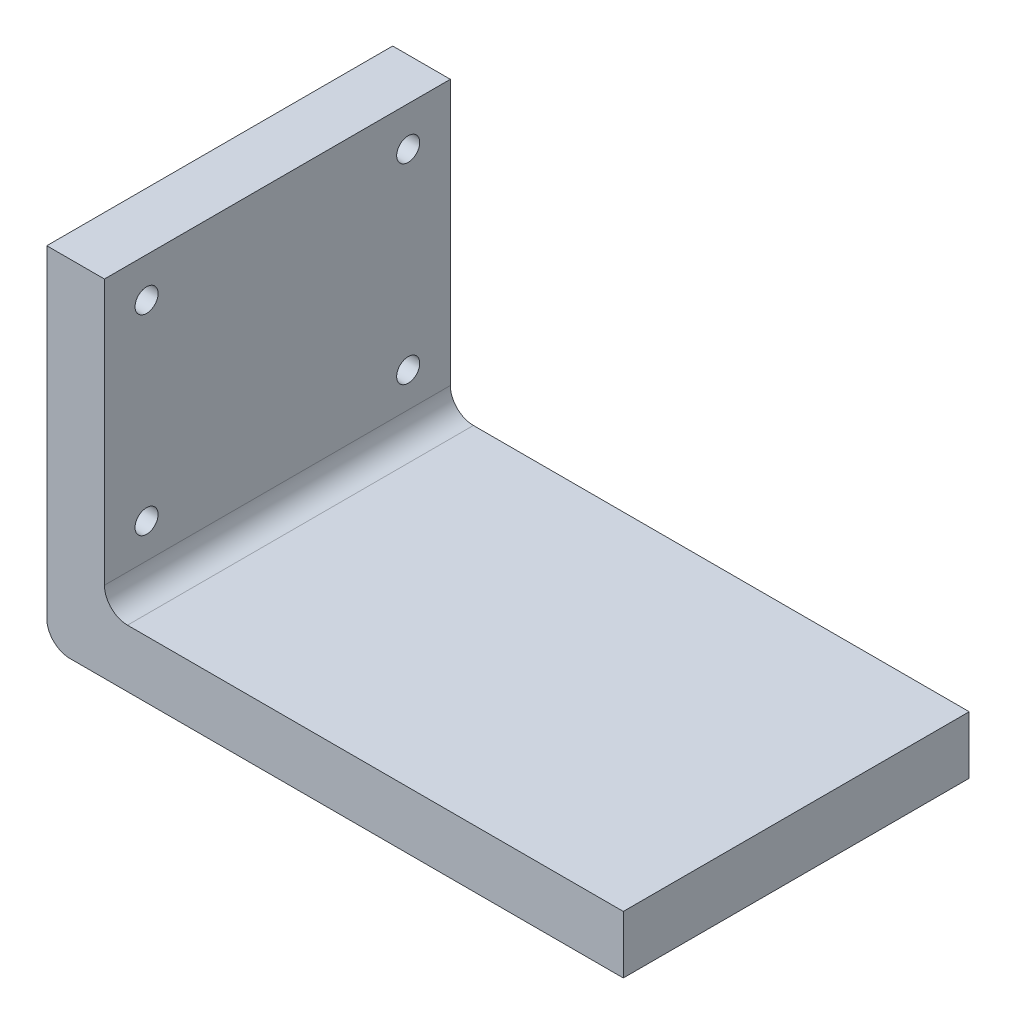
ISO-10303-21;
HEADER;
FILE_DESCRIPTION(('STEP AP214'),'2;1');
FILE_NAME('part.step','',(''),(''),'','','');
FILE_SCHEMA(('AUTOMOTIVE_DESIGN { 1 0 10303 214 1 1 1 1 }'));
ENDSEC;
DATA;
#1=APPLICATION_CONTEXT('core data for automotive mechanical design processes');
#2=APPLICATION_PROTOCOL_DEFINITION('international standard','automotive_design',2000,#1);
#3=PRODUCT_CONTEXT('',#1,'mechanical');
#4=PRODUCT('Part','Part','',(#3));
#5=PRODUCT_RELATED_PRODUCT_CATEGORY('part','',(#4));
#6=PRODUCT_DEFINITION_FORMATION('','',#4);
#7=PRODUCT_DEFINITION_CONTEXT('part definition',#1,'design');
#8=PRODUCT_DEFINITION('design','',#6,#7);
#9=PRODUCT_DEFINITION_SHAPE('','',#8);
#10=(LENGTH_UNIT() NAMED_UNIT(*) SI_UNIT(.MILLI.,.METRE.));
#11=(NAMED_UNIT(*) PLANE_ANGLE_UNIT() SI_UNIT($,.RADIAN.));
#12=(NAMED_UNIT(*) SI_UNIT($,.STERADIAN.) SOLID_ANGLE_UNIT());
#13=UNCERTAINTY_MEASURE_WITH_UNIT(LENGTH_MEASURE(1.E-05),#10,'distance_accuracy_value','');
#14=(GEOMETRIC_REPRESENTATION_CONTEXT(3) GLOBAL_UNCERTAINTY_ASSIGNED_CONTEXT((#13)) GLOBAL_UNIT_ASSIGNED_CONTEXT((#10,
#11,#12)) REPRESENTATION_CONTEXT('',''));
#15=CARTESIAN_POINT('',(0.,0.,0.));
#16=DIRECTION('',(0.,0.,1.));
#17=DIRECTION('',(1.,0.,0.));
#18=AXIS2_PLACEMENT_3D('',#15,#16,#17);
#19=CARTESIAN_POINT('',(0.,76.2,76.2));
#20=DIRECTION('',(0.,-1.,0.));
#21=DIRECTION('',(0.,0.,-1.));
#22=AXIS2_PLACEMENT_3D('',#19,#20,#21);
#23=PLANE('',#22);
#24=DIRECTION('',(-1.,0.,0.));
#25=VECTOR('',#24,1.);
#26=CARTESIAN_POINT('',(0.,76.2,0.));
#27=LINE('',#26,#25);
#28=CARTESIAN_POINT('',(12.7,76.2,0.));
#29=VERTEX_POINT('',#28);
#30=CARTESIAN_POINT('',(0.,76.2,0.));
#31=VERTEX_POINT('',#30);
#32=EDGE_CURVE('E131',#29,#31,#27,.T.);
#33=ORIENTED_EDGE('',*,*,#32,.T.);
#34=DIRECTION('',(0.,0.,-1.));
#35=VECTOR('',#34,1.);
#36=CARTESIAN_POINT('',(0.,76.2,76.2));
#37=LINE('',#36,#35);
#38=CARTESIAN_POINT('',(0.,76.2,76.2));
#39=VERTEX_POINT('',#38);
#40=EDGE_CURVE('E11',#39,#31,#37,.T.);
#41=ORIENTED_EDGE('',*,*,#40,.F.);
#42=DIRECTION('',(-1.,0.,0.));
#43=VECTOR('',#42,1.);
#44=CARTESIAN_POINT('',(0.,76.2,76.2));
#45=LINE('',#44,#43);
#46=CARTESIAN_POINT('',(12.7,76.2,76.2));
#47=VERTEX_POINT('',#46);
#48=EDGE_CURVE('E145',#47,#39,#45,.T.);
#49=ORIENTED_EDGE('',*,*,#48,.F.);
#50=DIRECTION('',(0.,0.,-1.));
#51=VECTOR('',#50,1.);
#52=CARTESIAN_POINT('',(12.7,76.2,76.2));
#53=LINE('',#52,#51);
#54=EDGE_CURVE('E127',#47,#29,#53,.T.);
#55=ORIENTED_EDGE('',*,*,#54,.T.);
#56=EDGE_LOOP('',(#33,#41,#49,#55));
#57=FACE_BOUND('',#56,.T.);
#58=ADVANCED_FACE('F33',(#57),#23,.F.);
#59=CARTESIAN_POINT('',(0.,5.08000000000003,76.2));
#60=DIRECTION('',(1.,0.,0.));
#61=DIRECTION('',(0.,0.,-1.));
#62=AXIS2_PLACEMENT_3D('',#59,#60,#61);
#63=PLANE('',#62);
#64=CARTESIAN_POINT('',(0.,25.4,9.28440190668444));
#65=DIRECTION('',(-1.,0.,0.));
#66=DIRECTION('',(0.,0.,1.));
#67=AXIS2_PLACEMENT_3D('',#64,#65,#66);
#68=CIRCLE('',#67,2.54);
#69=CARTESIAN_POINT('',(0.,25.4,11.8244019066844));
#70=VERTEX_POINT('',#69);
#71=EDGE_CURVE('E214',#70,#70,#68,.T.);
#72=ORIENTED_EDGE('',*,*,#71,.F.);
#73=EDGE_LOOP('',(#72));
#74=FACE_BOUND('',#73,.T.);
#75=CARTESIAN_POINT('',(0.,67.5345582204279,66.9155980933156));
#76=DIRECTION('',(-1.,0.,0.));
#77=DIRECTION('',(0.,0.,1.));
#78=AXIS2_PLACEMENT_3D('',#75,#76,#77);
#79=CIRCLE('',#78,2.53999999999999);
#80=CARTESIAN_POINT('',(0.,67.5345582204279,69.4555980933156));
#81=VERTEX_POINT('',#80);
#82=EDGE_CURVE('E216',#81,#81,#79,.T.);
#83=ORIENTED_EDGE('',*,*,#82,.F.);
#84=EDGE_LOOP('',(#83));
#85=FACE_BOUND('',#84,.T.);
#86=CARTESIAN_POINT('',(0.,25.4,66.9155980933156));
#87=DIRECTION('',(-1.,0.,0.));
#88=DIRECTION('',(0.,0.,1.));
#89=AXIS2_PLACEMENT_3D('',#86,#87,#88);
#90=CIRCLE('',#89,2.54);
#91=CARTESIAN_POINT('',(0.,25.4,69.4555980933156));
#92=VERTEX_POINT('',#91);
#93=EDGE_CURVE('E213',#92,#92,#90,.T.);
#94=ORIENTED_EDGE('',*,*,#93,.F.);
#95=EDGE_LOOP('',(#94));
#96=FACE_BOUND('',#95,.T.);
#97=CARTESIAN_POINT('',(0.,67.5345582204279,9.28440190668444));
#98=DIRECTION('',(-1.,0.,0.));
#99=DIRECTION('',(0.,0.,1.));
#100=AXIS2_PLACEMENT_3D('',#97,#98,#99);
#101=CIRCLE('',#100,2.54);
#102=CARTESIAN_POINT('',(0.,67.5345582204279,11.8244019066844));
#103=VERTEX_POINT('',#102);
#104=EDGE_CURVE('E161',#103,#103,#101,.T.);
#105=ORIENTED_EDGE('',*,*,#104,.F.);
#106=EDGE_LOOP('',(#105));
#107=FACE_BOUND('',#106,.T.);
#108=DIRECTION('',(0.,-1.,0.));
#109=VECTOR('',#108,1.);
#110=CARTESIAN_POINT('',(0.,5.08000000000003,0.));
#111=LINE('',#110,#109);
#112=CARTESIAN_POINT('',(0.,5.08000000000003,0.));
#113=VERTEX_POINT('',#112);
#114=EDGE_CURVE('E134',#31,#113,#111,.T.);
#115=ORIENTED_EDGE('',*,*,#114,.T.);
#116=DIRECTION('',(0.,0.,-1.));
#117=VECTOR('',#116,1.);
#118=CARTESIAN_POINT('',(0.,5.08000000000003,76.2));
#119=LINE('',#118,#117);
#120=CARTESIAN_POINT('',(0.,5.08000000000003,76.2));
#121=VERTEX_POINT('',#120);
#122=EDGE_CURVE('E42',#121,#113,#119,.T.);
#123=ORIENTED_EDGE('',*,*,#122,.F.);
#124=DIRECTION('',(0.,-1.,0.));
#125=VECTOR('',#124,1.);
#126=CARTESIAN_POINT('',(0.,5.08000000000003,76.2));
#127=LINE('',#126,#125);
#128=EDGE_CURVE('E94',#39,#121,#127,.T.);
#129=ORIENTED_EDGE('',*,*,#128,.F.);
#130=ORIENTED_EDGE('',*,*,#40,.T.);
#131=EDGE_LOOP('',(#115,#123,#129,#130));
#132=FACE_BOUND('',#131,.T.);
#133=ADVANCED_FACE('F186',(#74,#85,#96,#107,#132),#63,.F.);
#134=CARTESIAN_POINT('',(5.08,5.08,76.2));
#135=DIRECTION('',(0.,0.,-1.));
#136=DIRECTION('',(-1.,0.,0.));
#137=AXIS2_PLACEMENT_3D('',#134,#135,#136);
#138=CYLINDRICAL_SURFACE('',#137,5.08);
#139=CARTESIAN_POINT('',(5.08,5.08,0.));
#140=DIRECTION('',(0.,0.,1.));
#141=DIRECTION('',(-1.,0.,0.));
#142=AXIS2_PLACEMENT_3D('',#139,#140,#141);
#143=CIRCLE('',#142,5.08);
#144=CARTESIAN_POINT('',(5.08000000000004,0.,0.));
#145=VERTEX_POINT('',#144);
#146=EDGE_CURVE('E136',#113,#145,#143,.T.);
#147=ORIENTED_EDGE('',*,*,#146,.T.);
#148=DIRECTION('',(0.,0.,-1.));
#149=VECTOR('',#148,1.);
#150=CARTESIAN_POINT('',(5.08000000000004,0.,76.2));
#151=LINE('',#150,#149);
#152=CARTESIAN_POINT('',(5.08000000000004,0.,76.2));
#153=VERTEX_POINT('',#152);
#154=EDGE_CURVE('E152',#153,#145,#151,.T.);
#155=ORIENTED_EDGE('',*,*,#154,.F.);
#156=CARTESIAN_POINT('',(5.08,5.08,76.2));
#157=DIRECTION('',(0.,0.,1.));
#158=DIRECTION('',(-1.,0.,0.));
#159=AXIS2_PLACEMENT_3D('',#156,#157,#158);
#160=CIRCLE('',#159,5.08);
#161=EDGE_CURVE('E203',#121,#153,#160,.T.);
#162=ORIENTED_EDGE('',*,*,#161,.F.);
#163=ORIENTED_EDGE('',*,*,#122,.T.);
#164=EDGE_LOOP('',(#147,#155,#162,#163));
#165=FACE_BOUND('',#164,.T.);
#166=ADVANCED_FACE('F191',(#165),#138,.T.);
#167=CARTESIAN_POINT('',(127.,0.,76.2));
#168=DIRECTION('',(0.,1.,0.));
#169=DIRECTION('',(0.,0.,1.));
#170=AXIS2_PLACEMENT_3D('',#167,#168,#169);
#171=PLANE('',#170);
#172=DIRECTION('',(1.,0.,0.));
#173=VECTOR('',#172,1.);
#174=CARTESIAN_POINT('',(127.,0.,0.));
#175=LINE('',#174,#173);
#176=CARTESIAN_POINT('',(127.,0.,0.));
#177=VERTEX_POINT('',#176);
#178=EDGE_CURVE('E138',#145,#177,#175,.T.);
#179=ORIENTED_EDGE('',*,*,#178,.T.);
#180=DIRECTION('',(0.,0.,-1.));
#181=VECTOR('',#180,1.);
#182=CARTESIAN_POINT('',(127.,0.,76.2));
#183=LINE('',#182,#181);
#184=CARTESIAN_POINT('',(127.,0.,76.2));
#185=VERTEX_POINT('',#184);
#186=EDGE_CURVE('E149',#185,#177,#183,.T.);
#187=ORIENTED_EDGE('',*,*,#186,.F.);
#188=DIRECTION('',(1.,0.,0.));
#189=VECTOR('',#188,1.);
#190=CARTESIAN_POINT('',(127.,0.,76.2));
#191=LINE('',#190,#189);
#192=EDGE_CURVE('E205',#153,#185,#191,.T.);
#193=ORIENTED_EDGE('',*,*,#192,.F.);
#194=ORIENTED_EDGE('',*,*,#154,.T.);
#195=EDGE_LOOP('',(#179,#187,#193,#194));
#196=FACE_BOUND('',#195,.T.);
#197=ADVANCED_FACE('F247',(#196),#171,.F.);
#198=CARTESIAN_POINT('',(127.,12.7,76.2));
#199=DIRECTION('',(-1.,0.,0.));
#200=DIRECTION('',(0.,0.,1.));
#201=AXIS2_PLACEMENT_3D('',#198,#199,#200);
#202=PLANE('',#201);
#203=DIRECTION('',(0.,1.,0.));
#204=VECTOR('',#203,1.);
#205=CARTESIAN_POINT('',(127.,12.7,0.));
#206=LINE('',#205,#204);
#207=CARTESIAN_POINT('',(127.,12.7,0.));
#208=VERTEX_POINT('',#207);
#209=EDGE_CURVE('E140',#177,#208,#206,.T.);
#210=ORIENTED_EDGE('',*,*,#209,.T.);
#211=DIRECTION('',(0.,0.,-1.));
#212=VECTOR('',#211,1.);
#213=CARTESIAN_POINT('',(127.,12.7,76.2));
#214=LINE('',#213,#212);
#215=CARTESIAN_POINT('',(127.,12.7,76.2));
#216=VERTEX_POINT('',#215);
#217=EDGE_CURVE('E122',#216,#208,#214,.T.);
#218=ORIENTED_EDGE('',*,*,#217,.F.);
#219=DIRECTION('',(0.,1.,0.));
#220=VECTOR('',#219,1.);
#221=CARTESIAN_POINT('',(127.,12.7,76.2));
#222=LINE('',#221,#220);
#223=EDGE_CURVE('E113',#185,#216,#222,.T.);
#224=ORIENTED_EDGE('',*,*,#223,.F.);
#225=ORIENTED_EDGE('',*,*,#186,.T.);
#226=EDGE_LOOP('',(#210,#218,#224,#225));
#227=FACE_BOUND('',#226,.T.);
#228=ADVANCED_FACE('F244',(#227),#202,.F.);
#229=CARTESIAN_POINT('',(17.78,12.7,76.2));
#230=DIRECTION('',(0.,-1.,0.));
#231=DIRECTION('',(0.,0.,-1.));
#232=AXIS2_PLACEMENT_3D('',#229,#230,#231);
#233=PLANE('',#232);
#234=DIRECTION('',(-1.,0.,0.));
#235=VECTOR('',#234,1.);
#236=CARTESIAN_POINT('',(17.78,12.7,0.));
#237=LINE('',#236,#235);
#238=CARTESIAN_POINT('',(17.78,12.7,0.));
#239=VERTEX_POINT('',#238);
#240=EDGE_CURVE('E121',#208,#239,#237,.T.);
#241=ORIENTED_EDGE('',*,*,#240,.T.);
#242=DIRECTION('',(0.,0.,-1.));
#243=VECTOR('',#242,1.);
#244=CARTESIAN_POINT('',(17.78,12.7,76.2));
#245=LINE('',#244,#243);
#246=CARTESIAN_POINT('',(17.78,12.7,76.2));
#247=VERTEX_POINT('',#246);
#248=EDGE_CURVE('E118',#247,#239,#245,.T.);
#249=ORIENTED_EDGE('',*,*,#248,.F.);
#250=DIRECTION('',(-1.,0.,0.));
#251=VECTOR('',#250,1.);
#252=CARTESIAN_POINT('',(17.78,12.7,76.2));
#253=LINE('',#252,#251);
#254=EDGE_CURVE('E107',#216,#247,#253,.T.);
#255=ORIENTED_EDGE('',*,*,#254,.F.);
#256=ORIENTED_EDGE('',*,*,#217,.T.);
#257=EDGE_LOOP('',(#241,#249,#255,#256));
#258=FACE_BOUND('',#257,.T.);
#259=ADVANCED_FACE('F119',(#258),#233,.F.);
#260=CARTESIAN_POINT('',(17.78,17.78,76.2));
#261=DIRECTION('',(0.,0.,-1.));
#262=DIRECTION('',(-1.,0.,0.));
#263=AXIS2_PLACEMENT_3D('',#260,#261,#262);
#264=CYLINDRICAL_SURFACE('',#263,5.08);
#265=CARTESIAN_POINT('',(17.78,17.78,0.));
#266=DIRECTION('',(0.,0.,-1.));
#267=DIRECTION('',(-1.,0.,0.));
#268=AXIS2_PLACEMENT_3D('',#265,#266,#267);
#269=CIRCLE('',#268,5.08);
#270=CARTESIAN_POINT('',(12.7,17.78,0.));
#271=VERTEX_POINT('',#270);
#272=EDGE_CURVE('E80',#239,#271,#269,.T.);
#273=ORIENTED_EDGE('',*,*,#272,.T.);
#274=DIRECTION('',(0.,0.,-1.));
#275=VECTOR('',#274,1.);
#276=CARTESIAN_POINT('',(12.7,17.78,76.2));
#277=LINE('',#276,#275);
#278=CARTESIAN_POINT('',(12.7,17.78,76.2));
#279=VERTEX_POINT('',#278);
#280=EDGE_CURVE('E123',#279,#271,#277,.T.);
#281=ORIENTED_EDGE('',*,*,#280,.F.);
#282=CARTESIAN_POINT('',(17.78,17.78,76.2));
#283=DIRECTION('',(0.,0.,-1.));
#284=DIRECTION('',(-1.,0.,0.));
#285=AXIS2_PLACEMENT_3D('',#282,#283,#284);
#286=CIRCLE('',#285,5.08);
#287=EDGE_CURVE('E111',#247,#279,#286,.T.);
#288=ORIENTED_EDGE('',*,*,#287,.F.);
#289=ORIENTED_EDGE('',*,*,#248,.T.);
#290=EDGE_LOOP('',(#273,#281,#288,#289));
#291=FACE_BOUND('',#290,.T.);
#292=ADVANCED_FACE('F125',(#291),#264,.F.);
#293=CARTESIAN_POINT('',(12.7,76.2,76.2));
#294=DIRECTION('',(-1.,0.,0.));
#295=DIRECTION('',(0.,-1.,0.));
#296=AXIS2_PLACEMENT_3D('',#293,#294,#295);
#297=PLANE('',#296);
#298=CARTESIAN_POINT('',(12.7,25.4,9.28440190668444));
#299=DIRECTION('',(-1.,0.,0.));
#300=DIRECTION('',(0.,-1.,0.));
#301=AXIS2_PLACEMENT_3D('',#298,#299,#300);
#302=CIRCLE('',#301,2.54);
#303=CARTESIAN_POINT('',(12.7,25.4,11.8244019066844));
#304=VERTEX_POINT('',#303);
#305=EDGE_CURVE('E36',#304,#304,#302,.T.);
#306=ORIENTED_EDGE('',*,*,#305,.T.);
#307=EDGE_LOOP('',(#306));
#308=FACE_BOUND('',#307,.T.);
#309=CARTESIAN_POINT('',(12.7,67.5345582204279,66.9155980933156));
#310=DIRECTION('',(-1.,0.,0.));
#311=DIRECTION('',(0.,-1.,0.));
#312=AXIS2_PLACEMENT_3D('',#309,#310,#311);
#313=CIRCLE('',#312,2.53999999999999);
#314=CARTESIAN_POINT('',(12.7,67.5345582204279,69.4555980933156));
#315=VERTEX_POINT('',#314);
#316=EDGE_CURVE('E163',#315,#315,#313,.T.);
#317=ORIENTED_EDGE('',*,*,#316,.T.);
#318=EDGE_LOOP('',(#317));
#319=FACE_BOUND('',#318,.T.);
#320=CARTESIAN_POINT('',(12.7,25.4,66.9155980933156));
#321=DIRECTION('',(-1.,0.,0.));
#322=DIRECTION('',(0.,-1.,0.));
#323=AXIS2_PLACEMENT_3D('',#320,#321,#322);
#324=CIRCLE('',#323,2.54);
#325=CARTESIAN_POINT('',(12.7,25.4,69.4555980933156));
#326=VERTEX_POINT('',#325);
#327=EDGE_CURVE('E160',#326,#326,#324,.T.);
#328=ORIENTED_EDGE('',*,*,#327,.T.);
#329=EDGE_LOOP('',(#328));
#330=FACE_BOUND('',#329,.T.);
#331=CARTESIAN_POINT('',(12.7,67.5345582204279,9.28440190668444));
#332=DIRECTION('',(-1.,0.,0.));
#333=DIRECTION('',(0.,-1.,0.));
#334=AXIS2_PLACEMENT_3D('',#331,#332,#333);
#335=CIRCLE('',#334,2.54);
#336=CARTESIAN_POINT('',(12.7,67.5345582204279,11.8244019066844));
#337=VERTEX_POINT('',#336);
#338=EDGE_CURVE('E157',#337,#337,#335,.T.);
#339=ORIENTED_EDGE('',*,*,#338,.T.);
#340=EDGE_LOOP('',(#339));
#341=FACE_BOUND('',#340,.T.);
#342=DIRECTION('',(0.,1.,0.));
#343=VECTOR('',#342,1.);
#344=CARTESIAN_POINT('',(12.7,76.2,0.));
#345=LINE('',#344,#343);
#346=EDGE_CURVE('E86',#271,#29,#345,.T.);
#347=ORIENTED_EDGE('',*,*,#346,.T.);
#348=ORIENTED_EDGE('',*,*,#54,.F.);
#349=DIRECTION('',(0.,1.,0.));
#350=VECTOR('',#349,1.);
#351=CARTESIAN_POINT('',(12.7,76.2,76.2));
#352=LINE('',#351,#350);
#353=EDGE_CURVE('E51',#279,#47,#352,.T.);
#354=ORIENTED_EDGE('',*,*,#353,.F.);
#355=ORIENTED_EDGE('',*,*,#280,.T.);
#356=EDGE_LOOP('',(#347,#348,#354,#355));
#357=FACE_BOUND('',#356,.T.);
#358=ADVANCED_FACE('F170',(#308,#319,#330,#341,#357),#297,.F.);
#359=CARTESIAN_POINT('',(17.78,17.78,76.2));
#360=DIRECTION('',(0.,0.,-1.));
#361=DIRECTION('',(-1.,0.,0.));
#362=AXIS2_PLACEMENT_3D('',#359,#360,#361);
#363=PLANE('',#362);
#364=ORIENTED_EDGE('',*,*,#48,.T.);
#365=ORIENTED_EDGE('',*,*,#128,.T.);
#366=ORIENTED_EDGE('',*,*,#161,.T.);
#367=ORIENTED_EDGE('',*,*,#192,.T.);
#368=ORIENTED_EDGE('',*,*,#223,.T.);
#369=ORIENTED_EDGE('',*,*,#254,.T.);
#370=ORIENTED_EDGE('',*,*,#287,.T.);
#371=ORIENTED_EDGE('',*,*,#353,.T.);
#372=EDGE_LOOP('',(#364,#365,#366,#367,#368,#369,#370,#371));
#373=FACE_BOUND('',#372,.T.);
#374=ADVANCED_FACE('F109',(#373),#363,.F.);
#375=CARTESIAN_POINT('',(17.78,17.78,0.));
#376=DIRECTION('',(0.,0.,-1.));
#377=DIRECTION('',(-1.,0.,0.));
#378=AXIS2_PLACEMENT_3D('',#375,#376,#377);
#379=PLANE('',#378);
#380=ORIENTED_EDGE('',*,*,#32,.F.);
#381=ORIENTED_EDGE('',*,*,#346,.F.);
#382=ORIENTED_EDGE('',*,*,#272,.F.);
#383=ORIENTED_EDGE('',*,*,#240,.F.);
#384=ORIENTED_EDGE('',*,*,#209,.F.);
#385=ORIENTED_EDGE('',*,*,#178,.F.);
#386=ORIENTED_EDGE('',*,*,#146,.F.);
#387=ORIENTED_EDGE('',*,*,#114,.F.);
#388=EDGE_LOOP('',(#380,#381,#382,#383,#384,#385,#386,#387));
#389=FACE_BOUND('',#388,.T.);
#390=ADVANCED_FACE('F197',(#389),#379,.T.);
#391=CARTESIAN_POINT('',(76.2,67.5345582204279,9.28440190668444));
#392=DIRECTION('',(-1.,0.,0.));
#393=DIRECTION('',(0.,0.,1.));
#394=AXIS2_PLACEMENT_3D('',#391,#392,#393);
#395=CYLINDRICAL_SURFACE('',#394,2.54);
#396=CARTESIAN_POINT('',(0.,67.5345582204279,11.8244019066844));
#397=CARTESIAN_POINT('',(0.132291666666668,67.5345582204279,11.8244019066844));
#398=CARTESIAN_POINT('',(0.264583333333337,67.5345582204279,11.8244019066844));
#399=CARTESIAN_POINT('',(0.529166666666669,67.5345582204279,11.8244019066844));
#400=CARTESIAN_POINT('',(0.661458333333332,67.5345582204279,11.8244019066844));
#401=CARTESIAN_POINT('',(0.926041666666664,67.5345582204279,11.8244019066844));
#402=CARTESIAN_POINT('',(1.05833333333333,67.5345582204279,11.8244019066844));
#403=CARTESIAN_POINT('',(1.32291666666667,67.5345582204279,11.8244019066844));
#404=CARTESIAN_POINT('',(1.45520833333334,67.5345582204279,11.8244019066844));
#405=CARTESIAN_POINT('',(1.71979166666667,67.5345582204279,11.8244019066844));
#406=CARTESIAN_POINT('',(1.85208333333333,67.5345582204279,11.8244019066844));
#407=CARTESIAN_POINT('',(2.11666666666666,67.5345582204279,11.8244019066844));
#408=CARTESIAN_POINT('',(2.24895833333333,67.5345582204279,11.8244019066844));
#409=CARTESIAN_POINT('',(2.51354166666667,67.5345582204279,11.8244019066844));
#410=CARTESIAN_POINT('',(2.64583333333334,67.5345582204279,11.8244019066844));
#411=CARTESIAN_POINT('',(2.91041666666667,67.5345582204279,11.8244019066844));
#412=CARTESIAN_POINT('',(3.04270833333334,67.5345582204279,11.8244019066844));
#413=CARTESIAN_POINT('',(3.30729166666667,67.5345582204279,11.8244019066844));
#414=CARTESIAN_POINT('',(3.43958333333334,67.5345582204279,11.8244019066844));
#415=CARTESIAN_POINT('',(3.70416666666667,67.5345582204279,11.8244019066844));
#416=CARTESIAN_POINT('',(3.83645833333334,67.5345582204279,11.8244019066844));
#417=CARTESIAN_POINT('',(4.10104166666668,67.5345582204279,11.8244019066844));
#418=CARTESIAN_POINT('',(4.23333333333334,67.5345582204279,11.8244019066844));
#419=CARTESIAN_POINT('',(4.49791666666668,67.5345582204279,11.8244019066844));
#420=CARTESIAN_POINT('',(4.63020833333334,67.5345582204279,11.8244019066844));
#421=CARTESIAN_POINT('',(4.89479166666667,67.5345582204279,11.8244019066844));
#422=CARTESIAN_POINT('',(5.02708333333334,67.5345582204279,11.8244019066844));
#423=CARTESIAN_POINT('',(5.29166666666668,67.5345582204279,11.8244019066844));
#424=CARTESIAN_POINT('',(5.42395833333334,67.5345582204279,11.8244019066844));
#425=CARTESIAN_POINT('',(5.68854166666668,67.5345582204279,11.8244019066844));
#426=CARTESIAN_POINT('',(5.82083333333334,67.5345582204279,11.8244019066844));
#427=CARTESIAN_POINT('',(6.08541666666667,67.5345582204279,11.8244019066844));
#428=CARTESIAN_POINT('',(6.21770833333334,67.5345582204279,11.8244019066844));
#429=CARTESIAN_POINT('',(6.48229166666668,67.5345582204279,11.8244019066844));
#430=CARTESIAN_POINT('',(6.61458333333334,67.5345582204279,11.8244019066844));
#431=CARTESIAN_POINT('',(6.87916666666668,67.5345582204279,11.8244019066844));
#432=CARTESIAN_POINT('',(7.01145833333334,67.5345582204279,11.8244019066844));
#433=CARTESIAN_POINT('',(7.27604166666667,67.5345582204279,11.8244019066844));
#434=CARTESIAN_POINT('',(7.40833333333334,67.5345582204279,11.8244019066844));
#435=CARTESIAN_POINT('',(7.67291666666668,67.5345582204279,11.8244019066844));
#436=CARTESIAN_POINT('',(7.80520833333335,67.5345582204279,11.8244019066844));
#437=CARTESIAN_POINT('',(8.06979166666668,67.5345582204279,11.8244019066844));
#438=CARTESIAN_POINT('',(8.20208333333334,67.5345582204279,11.8244019066844));
#439=CARTESIAN_POINT('',(8.46666666666667,67.5345582204279,11.8244019066844));
#440=CARTESIAN_POINT('',(8.59895833333334,67.5345582204279,11.8244019066844));
#441=CARTESIAN_POINT('',(8.86354166666668,67.5345582204279,11.8244019066844));
#442=CARTESIAN_POINT('',(8.99583333333335,67.5345582204279,11.8244019066844));
#443=CARTESIAN_POINT('',(9.26041666666668,67.5345582204279,11.8244019066844));
#444=CARTESIAN_POINT('',(9.39270833333334,67.5345582204279,11.8244019066844));
#445=CARTESIAN_POINT('',(9.65729166666667,67.5345582204279,11.8244019066844));
#446=CARTESIAN_POINT('',(9.78958333333334,67.5345582204279,11.8244019066844));
#447=CARTESIAN_POINT('',(10.0541666666667,67.5345582204279,11.8244019066844));
#448=CARTESIAN_POINT('',(10.1864583333333,67.5345582204279,11.8244019066844));
#449=CARTESIAN_POINT('',(10.4510416666667,67.5345582204279,11.8244019066844));
#450=CARTESIAN_POINT('',(10.5833333333333,67.5345582204279,11.8244019066844));
#451=CARTESIAN_POINT('',(10.8479166666667,67.5345582204279,11.8244019066844));
#452=CARTESIAN_POINT('',(10.9802083333333,67.5345582204279,11.8244019066844));
#453=CARTESIAN_POINT('',(11.2447916666667,67.5345582204279,11.8244019066844));
#454=CARTESIAN_POINT('',(11.3770833333333,67.5345582204279,11.8244019066844));
#455=CARTESIAN_POINT('',(11.6416666666667,67.5345582204279,11.8244019066844));
#456=CARTESIAN_POINT('',(11.7739583333334,67.5345582204279,11.8244019066844));
#457=CARTESIAN_POINT('',(12.0385416666667,67.5345582204279,11.8244019066844));
#458=CARTESIAN_POINT('',(12.1708333333333,67.5345582204279,11.8244019066844));
#459=CARTESIAN_POINT('',(12.4354166666667,67.5345582204279,11.8244019066844));
#460=CARTESIAN_POINT('',(12.5677083333333,67.5345582204279,11.8244019066844));
#461=CARTESIAN_POINT('',(12.7,67.5345582204279,11.8244019066844));
#462=B_SPLINE_CURVE_WITH_KNOTS('',3,(#396,#397,#398,#399,#400,#401,#402,#403,#404,#405,#406,
#407,#408,#409,#410,#411,#412,#413,#414,#415,#416,#417,#418,#419,#420,#421,#422,#423,#424,#425,
#426,#427,#428,#429,#430,#431,#432,#433,#434,#435,#436,#437,#438,#439,#440,#441,#442,#443,#444,
#445,#446,#447,#448,#449,#450,#451,#452,#453,#454,#455,#456,#457,#458,#459,#460,#461),
.UNSPECIFIED.,.F.,.F.,(4,2,2,2,2,2,2,2,2,2,2,2,2,2,2,2,2,2,2,2,2,2,2,2,2,2,2,2,2,2,2,2,4),(0.,
0.396875000000005,0.793749999999996,1.190625,1.58750000000001,1.984375,2.38125,2.77812500000001,
3.17500000000001,3.571875,3.96875000000001,4.36562500000001,4.7625,5.15937500000001,
5.55625000000001,5.953125,6.35000000000001,6.74687500000001,7.14375,7.54062500000001,
7.93750000000001,8.334375,8.73125000000001,9.12812500000001,9.52500000000001,9.92187500000001,
10.31875,10.715625,11.1125,11.509375,11.90625,12.303125,12.7),.UNSPECIFIED.);
#463=EDGE_CURVE('BSEAM227',#103,#337,#462,.T.);
#464=ORIENTED_EDGE('',*,*,#104,.T.);
#465=ORIENTED_EDGE('',*,*,#338,.F.);
#466=ORIENTED_EDGE('',*,*,#463,.T.);
#467=ORIENTED_EDGE('',*,*,#463,.F.);
#468=EDGE_LOOP('',(#464,#466,#465,#467));
#469=FACE_BOUND('',#468,.T.);
#470=ADVANCED_FACE('F227',(#469),#395,.F.);
#471=CARTESIAN_POINT('',(76.2,25.4,66.9155980933156));
#472=DIRECTION('',(-1.,0.,0.));
#473=DIRECTION('',(0.,0.,1.));
#474=AXIS2_PLACEMENT_3D('',#471,#472,#473);
#475=CYLINDRICAL_SURFACE('',#474,2.54);
#476=CARTESIAN_POINT('',(0.,25.4,69.4555980933156));
#477=CARTESIAN_POINT('',(0.132291666666668,25.4,69.4555980933156));
#478=CARTESIAN_POINT('',(0.264583333333337,25.4,69.4555980933156));
#479=CARTESIAN_POINT('',(0.529166666666669,25.4,69.4555980933156));
#480=CARTESIAN_POINT('',(0.661458333333332,25.4,69.4555980933156));
#481=CARTESIAN_POINT('',(0.926041666666664,25.4,69.4555980933156));
#482=CARTESIAN_POINT('',(1.05833333333333,25.4,69.4555980933156));
#483=CARTESIAN_POINT('',(1.32291666666667,25.4,69.4555980933156));
#484=CARTESIAN_POINT('',(1.45520833333334,25.4,69.4555980933156));
#485=CARTESIAN_POINT('',(1.71979166666667,25.4,69.4555980933156));
#486=CARTESIAN_POINT('',(1.85208333333333,25.4,69.4555980933156));
#487=CARTESIAN_POINT('',(2.11666666666666,25.4,69.4555980933156));
#488=CARTESIAN_POINT('',(2.24895833333333,25.4,69.4555980933156));
#489=CARTESIAN_POINT('',(2.51354166666667,25.4,69.4555980933156));
#490=CARTESIAN_POINT('',(2.64583333333334,25.4,69.4555980933156));
#491=CARTESIAN_POINT('',(2.91041666666667,25.4,69.4555980933156));
#492=CARTESIAN_POINT('',(3.04270833333334,25.4,69.4555980933156));
#493=CARTESIAN_POINT('',(3.30729166666667,25.4,69.4555980933156));
#494=CARTESIAN_POINT('',(3.43958333333334,25.4,69.4555980933156));
#495=CARTESIAN_POINT('',(3.70416666666667,25.4,69.4555980933156));
#496=CARTESIAN_POINT('',(3.83645833333334,25.4,69.4555980933156));
#497=CARTESIAN_POINT('',(4.10104166666668,25.4,69.4555980933156));
#498=CARTESIAN_POINT('',(4.23333333333334,25.4,69.4555980933156));
#499=CARTESIAN_POINT('',(4.49791666666668,25.4,69.4555980933156));
#500=CARTESIAN_POINT('',(4.63020833333334,25.4,69.4555980933156));
#501=CARTESIAN_POINT('',(4.89479166666667,25.4,69.4555980933156));
#502=CARTESIAN_POINT('',(5.02708333333334,25.4,69.4555980933156));
#503=CARTESIAN_POINT('',(5.29166666666668,25.4,69.4555980933156));
#504=CARTESIAN_POINT('',(5.42395833333334,25.4,69.4555980933156));
#505=CARTESIAN_POINT('',(5.68854166666668,25.4,69.4555980933156));
#506=CARTESIAN_POINT('',(5.82083333333334,25.4,69.4555980933156));
#507=CARTESIAN_POINT('',(6.08541666666667,25.4,69.4555980933156));
#508=CARTESIAN_POINT('',(6.21770833333334,25.4,69.4555980933156));
#509=CARTESIAN_POINT('',(6.48229166666668,25.4,69.4555980933156));
#510=CARTESIAN_POINT('',(6.61458333333334,25.4,69.4555980933156));
#511=CARTESIAN_POINT('',(6.87916666666668,25.4,69.4555980933156));
#512=CARTESIAN_POINT('',(7.01145833333334,25.4,69.4555980933156));
#513=CARTESIAN_POINT('',(7.27604166666667,25.4,69.4555980933156));
#514=CARTESIAN_POINT('',(7.40833333333334,25.4,69.4555980933156));
#515=CARTESIAN_POINT('',(7.67291666666668,25.4,69.4555980933156));
#516=CARTESIAN_POINT('',(7.80520833333335,25.4,69.4555980933156));
#517=CARTESIAN_POINT('',(8.06979166666668,25.4,69.4555980933156));
#518=CARTESIAN_POINT('',(8.20208333333334,25.4,69.4555980933156));
#519=CARTESIAN_POINT('',(8.46666666666667,25.4,69.4555980933156));
#520=CARTESIAN_POINT('',(8.59895833333334,25.4,69.4555980933156));
#521=CARTESIAN_POINT('',(8.86354166666668,25.4,69.4555980933156));
#522=CARTESIAN_POINT('',(8.99583333333335,25.4,69.4555980933156));
#523=CARTESIAN_POINT('',(9.26041666666668,25.4,69.4555980933156));
#524=CARTESIAN_POINT('',(9.39270833333334,25.4,69.4555980933156));
#525=CARTESIAN_POINT('',(9.65729166666667,25.4,69.4555980933156));
#526=CARTESIAN_POINT('',(9.78958333333334,25.4,69.4555980933156));
#527=CARTESIAN_POINT('',(10.0541666666667,25.4,69.4555980933156));
#528=CARTESIAN_POINT('',(10.1864583333333,25.4,69.4555980933156));
#529=CARTESIAN_POINT('',(10.4510416666667,25.4,69.4555980933156));
#530=CARTESIAN_POINT('',(10.5833333333333,25.4,69.4555980933156));
#531=CARTESIAN_POINT('',(10.8479166666667,25.4,69.4555980933156));
#532=CARTESIAN_POINT('',(10.9802083333333,25.4,69.4555980933156));
#533=CARTESIAN_POINT('',(11.2447916666667,25.4,69.4555980933156));
#534=CARTESIAN_POINT('',(11.3770833333333,25.4,69.4555980933156));
#535=CARTESIAN_POINT('',(11.6416666666667,25.4,69.4555980933156));
#536=CARTESIAN_POINT('',(11.7739583333334,25.4,69.4555980933156));
#537=CARTESIAN_POINT('',(12.0385416666667,25.4,69.4555980933156));
#538=CARTESIAN_POINT('',(12.1708333333333,25.4,69.4555980933156));
#539=CARTESIAN_POINT('',(12.4354166666667,25.4,69.4555980933156));
#540=CARTESIAN_POINT('',(12.5677083333333,25.4,69.4555980933156));
#541=CARTESIAN_POINT('',(12.7,25.4,69.4555980933156));
#542=B_SPLINE_CURVE_WITH_KNOTS('',3,(#476,#477,#478,#479,#480,#481,#482,#483,#484,#485,#486,
#487,#488,#489,#490,#491,#492,#493,#494,#495,#496,#497,#498,#499,#500,#501,#502,#503,#504,#505,
#506,#507,#508,#509,#510,#511,#512,#513,#514,#515,#516,#517,#518,#519,#520,#521,#522,#523,#524,
#525,#526,#527,#528,#529,#530,#531,#532,#533,#534,#535,#536,#537,#538,#539,#540,#541),
.UNSPECIFIED.,.F.,.F.,(4,2,2,2,2,2,2,2,2,2,2,2,2,2,2,2,2,2,2,2,2,2,2,2,2,2,2,2,2,2,2,2,4),(0.,
0.396875000000005,0.793749999999996,1.190625,1.58750000000001,1.984375,2.38125,2.77812500000001,
3.17500000000001,3.571875,3.96875000000001,4.36562500000001,4.7625,5.15937500000001,
5.55625000000001,5.953125,6.35000000000001,6.74687500000001,7.14375,7.54062500000001,
7.93750000000001,8.334375,8.73125000000001,9.12812500000001,9.52500000000001,9.92187500000001,
10.31875,10.715625,11.1125,11.509375,11.90625,12.303125,12.7),.UNSPECIFIED.);
#543=EDGE_CURVE('BSEAM180',#92,#326,#542,.T.);
#544=ORIENTED_EDGE('',*,*,#93,.T.);
#545=ORIENTED_EDGE('',*,*,#327,.F.);
#546=ORIENTED_EDGE('',*,*,#543,.T.);
#547=ORIENTED_EDGE('',*,*,#543,.F.);
#548=EDGE_LOOP('',(#544,#546,#545,#547));
#549=FACE_BOUND('',#548,.T.);
#550=ADVANCED_FACE('F180',(#549),#475,.F.);
#551=CARTESIAN_POINT('',(76.2,67.5345582204279,66.9155980933156));
#552=DIRECTION('',(-1.,0.,0.));
#553=DIRECTION('',(0.,0.,1.));
#554=AXIS2_PLACEMENT_3D('',#551,#552,#553);
#555=CYLINDRICAL_SURFACE('',#554,2.53999999999999);
#556=CARTESIAN_POINT('',(0.,67.5345582204279,69.4555980933156));
#557=CARTESIAN_POINT('',(0.132291666666668,67.5345582204279,69.4555980933156));
#558=CARTESIAN_POINT('',(0.264583333333337,67.5345582204279,69.4555980933156));
#559=CARTESIAN_POINT('',(0.529166666666669,67.5345582204279,69.4555980933156));
#560=CARTESIAN_POINT('',(0.661458333333332,67.5345582204279,69.4555980933156));
#561=CARTESIAN_POINT('',(0.926041666666664,67.5345582204279,69.4555980933156));
#562=CARTESIAN_POINT('',(1.05833333333333,67.5345582204279,69.4555980933156));
#563=CARTESIAN_POINT('',(1.32291666666667,67.5345582204279,69.4555980933156));
#564=CARTESIAN_POINT('',(1.45520833333334,67.5345582204279,69.4555980933156));
#565=CARTESIAN_POINT('',(1.71979166666667,67.5345582204279,69.4555980933156));
#566=CARTESIAN_POINT('',(1.85208333333333,67.5345582204279,69.4555980933156));
#567=CARTESIAN_POINT('',(2.11666666666666,67.5345582204279,69.4555980933156));
#568=CARTESIAN_POINT('',(2.24895833333333,67.5345582204279,69.4555980933156));
#569=CARTESIAN_POINT('',(2.51354166666667,67.5345582204279,69.4555980933156));
#570=CARTESIAN_POINT('',(2.64583333333334,67.5345582204279,69.4555980933156));
#571=CARTESIAN_POINT('',(2.91041666666667,67.5345582204279,69.4555980933156));
#572=CARTESIAN_POINT('',(3.04270833333334,67.5345582204279,69.4555980933156));
#573=CARTESIAN_POINT('',(3.30729166666667,67.5345582204279,69.4555980933156));
#574=CARTESIAN_POINT('',(3.43958333333334,67.5345582204279,69.4555980933156));
#575=CARTESIAN_POINT('',(3.70416666666667,67.5345582204279,69.4555980933156));
#576=CARTESIAN_POINT('',(3.83645833333334,67.5345582204279,69.4555980933156));
#577=CARTESIAN_POINT('',(4.10104166666668,67.5345582204279,69.4555980933156));
#578=CARTESIAN_POINT('',(4.23333333333334,67.5345582204279,69.4555980933156));
#579=CARTESIAN_POINT('',(4.49791666666668,67.5345582204279,69.4555980933156));
#580=CARTESIAN_POINT('',(4.63020833333334,67.5345582204279,69.4555980933156));
#581=CARTESIAN_POINT('',(4.89479166666667,67.5345582204279,69.4555980933156));
#582=CARTESIAN_POINT('',(5.02708333333334,67.5345582204279,69.4555980933156));
#583=CARTESIAN_POINT('',(5.29166666666668,67.5345582204279,69.4555980933156));
#584=CARTESIAN_POINT('',(5.42395833333334,67.5345582204279,69.4555980933156));
#585=CARTESIAN_POINT('',(5.68854166666668,67.5345582204279,69.4555980933156));
#586=CARTESIAN_POINT('',(5.82083333333334,67.5345582204279,69.4555980933156));
#587=CARTESIAN_POINT('',(6.08541666666667,67.5345582204279,69.4555980933156));
#588=CARTESIAN_POINT('',(6.21770833333334,67.5345582204279,69.4555980933156));
#589=CARTESIAN_POINT('',(6.48229166666668,67.5345582204279,69.4555980933156));
#590=CARTESIAN_POINT('',(6.61458333333334,67.5345582204279,69.4555980933156));
#591=CARTESIAN_POINT('',(6.87916666666668,67.5345582204279,69.4555980933156));
#592=CARTESIAN_POINT('',(7.01145833333334,67.5345582204279,69.4555980933156));
#593=CARTESIAN_POINT('',(7.27604166666667,67.5345582204279,69.4555980933156));
#594=CARTESIAN_POINT('',(7.40833333333334,67.5345582204279,69.4555980933156));
#595=CARTESIAN_POINT('',(7.67291666666668,67.5345582204279,69.4555980933156));
#596=CARTESIAN_POINT('',(7.80520833333335,67.5345582204279,69.4555980933156));
#597=CARTESIAN_POINT('',(8.06979166666668,67.5345582204279,69.4555980933156));
#598=CARTESIAN_POINT('',(8.20208333333334,67.5345582204279,69.4555980933156));
#599=CARTESIAN_POINT('',(8.46666666666667,67.5345582204279,69.4555980933156));
#600=CARTESIAN_POINT('',(8.59895833333334,67.5345582204279,69.4555980933156));
#601=CARTESIAN_POINT('',(8.86354166666668,67.5345582204279,69.4555980933156));
#602=CARTESIAN_POINT('',(8.99583333333335,67.5345582204279,69.4555980933156));
#603=CARTESIAN_POINT('',(9.26041666666668,67.5345582204279,69.4555980933156));
#604=CARTESIAN_POINT('',(9.39270833333334,67.5345582204279,69.4555980933156));
#605=CARTESIAN_POINT('',(9.65729166666667,67.5345582204279,69.4555980933156));
#606=CARTESIAN_POINT('',(9.78958333333334,67.5345582204279,69.4555980933156));
#607=CARTESIAN_POINT('',(10.0541666666667,67.5345582204279,69.4555980933156));
#608=CARTESIAN_POINT('',(10.1864583333333,67.5345582204279,69.4555980933156));
#609=CARTESIAN_POINT('',(10.4510416666667,67.5345582204279,69.4555980933156));
#610=CARTESIAN_POINT('',(10.5833333333333,67.5345582204279,69.4555980933156));
#611=CARTESIAN_POINT('',(10.8479166666667,67.5345582204279,69.4555980933156));
#612=CARTESIAN_POINT('',(10.9802083333333,67.5345582204279,69.4555980933156));
#613=CARTESIAN_POINT('',(11.2447916666667,67.5345582204279,69.4555980933156));
#614=CARTESIAN_POINT('',(11.3770833333333,67.5345582204279,69.4555980933156));
#615=CARTESIAN_POINT('',(11.6416666666667,67.5345582204279,69.4555980933156));
#616=CARTESIAN_POINT('',(11.7739583333334,67.5345582204279,69.4555980933156));
#617=CARTESIAN_POINT('',(12.0385416666667,67.5345582204279,69.4555980933156));
#618=CARTESIAN_POINT('',(12.1708333333333,67.5345582204279,69.4555980933156));
#619=CARTESIAN_POINT('',(12.4354166666667,67.5345582204279,69.4555980933156));
#620=CARTESIAN_POINT('',(12.5677083333333,67.5345582204279,69.4555980933156));
#621=CARTESIAN_POINT('',(12.7,67.5345582204279,69.4555980933156));
#622=B_SPLINE_CURVE_WITH_KNOTS('',3,(#556,#557,#558,#559,#560,#561,#562,#563,#564,#565,#566,
#567,#568,#569,#570,#571,#572,#573,#574,#575,#576,#577,#578,#579,#580,#581,#582,#583,#584,#585,
#586,#587,#588,#589,#590,#591,#592,#593,#594,#595,#596,#597,#598,#599,#600,#601,#602,#603,#604,
#605,#606,#607,#608,#609,#610,#611,#612,#613,#614,#615,#616,#617,#618,#619,#620,#621),
.UNSPECIFIED.,.F.,.F.,(4,2,2,2,2,2,2,2,2,2,2,2,2,2,2,2,2,2,2,2,2,2,2,2,2,2,2,2,2,2,2,2,4),(0.,
0.396875000000005,0.793749999999996,1.190625,1.58750000000001,1.984375,2.38125,2.77812500000001,
3.17500000000001,3.571875,3.96875000000001,4.36562500000001,4.7625,5.15937500000001,
5.55625000000001,5.953125,6.35000000000001,6.74687500000001,7.14375,7.54062500000001,
7.93750000000001,8.334375,8.73125000000001,9.12812500000001,9.52500000000001,9.92187500000001,
10.31875,10.715625,11.1125,11.509375,11.90625,12.303125,12.7),.UNSPECIFIED.);
#623=EDGE_CURVE('BSEAM174',#81,#315,#622,.T.);
#624=ORIENTED_EDGE('',*,*,#82,.T.);
#625=ORIENTED_EDGE('',*,*,#316,.F.);
#626=ORIENTED_EDGE('',*,*,#623,.T.);
#627=ORIENTED_EDGE('',*,*,#623,.F.);
#628=EDGE_LOOP('',(#624,#626,#625,#627));
#629=FACE_BOUND('',#628,.T.);
#630=ADVANCED_FACE('F174',(#629),#555,.F.);
#631=CARTESIAN_POINT('',(76.2,25.4,9.28440190668444));
#632=DIRECTION('',(-1.,0.,0.));
#633=DIRECTION('',(0.,0.,1.));
#634=AXIS2_PLACEMENT_3D('',#631,#632,#633);
#635=CYLINDRICAL_SURFACE('',#634,2.54);
#636=CARTESIAN_POINT('',(0.,25.4,11.8244019066844));
#637=CARTESIAN_POINT('',(0.132291666666668,25.4,11.8244019066844));
#638=CARTESIAN_POINT('',(0.264583333333337,25.4,11.8244019066844));
#639=CARTESIAN_POINT('',(0.529166666666669,25.4,11.8244019066844));
#640=CARTESIAN_POINT('',(0.661458333333332,25.4,11.8244019066844));
#641=CARTESIAN_POINT('',(0.926041666666664,25.4,11.8244019066844));
#642=CARTESIAN_POINT('',(1.05833333333333,25.4,11.8244019066844));
#643=CARTESIAN_POINT('',(1.32291666666667,25.4,11.8244019066844));
#644=CARTESIAN_POINT('',(1.45520833333334,25.4,11.8244019066844));
#645=CARTESIAN_POINT('',(1.71979166666667,25.4,11.8244019066844));
#646=CARTESIAN_POINT('',(1.85208333333333,25.4,11.8244019066844));
#647=CARTESIAN_POINT('',(2.11666666666666,25.4,11.8244019066844));
#648=CARTESIAN_POINT('',(2.24895833333333,25.4,11.8244019066844));
#649=CARTESIAN_POINT('',(2.51354166666667,25.4,11.8244019066844));
#650=CARTESIAN_POINT('',(2.64583333333334,25.4,11.8244019066844));
#651=CARTESIAN_POINT('',(2.91041666666667,25.4,11.8244019066844));
#652=CARTESIAN_POINT('',(3.04270833333334,25.4,11.8244019066844));
#653=CARTESIAN_POINT('',(3.30729166666667,25.4,11.8244019066844));
#654=CARTESIAN_POINT('',(3.43958333333334,25.4,11.8244019066844));
#655=CARTESIAN_POINT('',(3.70416666666667,25.4,11.8244019066844));
#656=CARTESIAN_POINT('',(3.83645833333334,25.4,11.8244019066844));
#657=CARTESIAN_POINT('',(4.10104166666668,25.4,11.8244019066844));
#658=CARTESIAN_POINT('',(4.23333333333334,25.4,11.8244019066844));
#659=CARTESIAN_POINT('',(4.49791666666668,25.4,11.8244019066844));
#660=CARTESIAN_POINT('',(4.63020833333334,25.4,11.8244019066844));
#661=CARTESIAN_POINT('',(4.89479166666667,25.4,11.8244019066844));
#662=CARTESIAN_POINT('',(5.02708333333334,25.4,11.8244019066844));
#663=CARTESIAN_POINT('',(5.29166666666668,25.4,11.8244019066844));
#664=CARTESIAN_POINT('',(5.42395833333334,25.4,11.8244019066844));
#665=CARTESIAN_POINT('',(5.68854166666668,25.4,11.8244019066844));
#666=CARTESIAN_POINT('',(5.82083333333334,25.4,11.8244019066844));
#667=CARTESIAN_POINT('',(6.08541666666667,25.4,11.8244019066844));
#668=CARTESIAN_POINT('',(6.21770833333334,25.4,11.8244019066844));
#669=CARTESIAN_POINT('',(6.48229166666668,25.4,11.8244019066844));
#670=CARTESIAN_POINT('',(6.61458333333334,25.4,11.8244019066844));
#671=CARTESIAN_POINT('',(6.87916666666668,25.4,11.8244019066844));
#672=CARTESIAN_POINT('',(7.01145833333334,25.4,11.8244019066844));
#673=CARTESIAN_POINT('',(7.27604166666667,25.4,11.8244019066844));
#674=CARTESIAN_POINT('',(7.40833333333334,25.4,11.8244019066844));
#675=CARTESIAN_POINT('',(7.67291666666668,25.4,11.8244019066844));
#676=CARTESIAN_POINT('',(7.80520833333335,25.4,11.8244019066844));
#677=CARTESIAN_POINT('',(8.06979166666668,25.4,11.8244019066844));
#678=CARTESIAN_POINT('',(8.20208333333334,25.4,11.8244019066844));
#679=CARTESIAN_POINT('',(8.46666666666667,25.4,11.8244019066844));
#680=CARTESIAN_POINT('',(8.59895833333334,25.4,11.8244019066844));
#681=CARTESIAN_POINT('',(8.86354166666668,25.4,11.8244019066844));
#682=CARTESIAN_POINT('',(8.99583333333335,25.4,11.8244019066844));
#683=CARTESIAN_POINT('',(9.26041666666668,25.4,11.8244019066844));
#684=CARTESIAN_POINT('',(9.39270833333334,25.4,11.8244019066844));
#685=CARTESIAN_POINT('',(9.65729166666667,25.4,11.8244019066844));
#686=CARTESIAN_POINT('',(9.78958333333334,25.4,11.8244019066844));
#687=CARTESIAN_POINT('',(10.0541666666667,25.4,11.8244019066844));
#688=CARTESIAN_POINT('',(10.1864583333333,25.4,11.8244019066844));
#689=CARTESIAN_POINT('',(10.4510416666667,25.4,11.8244019066844));
#690=CARTESIAN_POINT('',(10.5833333333333,25.4,11.8244019066844));
#691=CARTESIAN_POINT('',(10.8479166666667,25.4,11.8244019066844));
#692=CARTESIAN_POINT('',(10.9802083333333,25.4,11.8244019066844));
#693=CARTESIAN_POINT('',(11.2447916666667,25.4,11.8244019066844));
#694=CARTESIAN_POINT('',(11.3770833333333,25.4,11.8244019066844));
#695=CARTESIAN_POINT('',(11.6416666666667,25.4,11.8244019066844));
#696=CARTESIAN_POINT('',(11.7739583333334,25.4,11.8244019066844));
#697=CARTESIAN_POINT('',(12.0385416666667,25.4,11.8244019066844));
#698=CARTESIAN_POINT('',(12.1708333333333,25.4,11.8244019066844));
#699=CARTESIAN_POINT('',(12.4354166666667,25.4,11.8244019066844));
#700=CARTESIAN_POINT('',(12.5677083333333,25.4,11.8244019066844));
#701=CARTESIAN_POINT('',(12.7,25.4,11.8244019066844));
#702=B_SPLINE_CURVE_WITH_KNOTS('',3,(#636,#637,#638,#639,#640,#641,#642,#643,#644,#645,#646,
#647,#648,#649,#650,#651,#652,#653,#654,#655,#656,#657,#658,#659,#660,#661,#662,#663,#664,#665,
#666,#667,#668,#669,#670,#671,#672,#673,#674,#675,#676,#677,#678,#679,#680,#681,#682,#683,#684,
#685,#686,#687,#688,#689,#690,#691,#692,#693,#694,#695,#696,#697,#698,#699,#700,#701),
.UNSPECIFIED.,.F.,.F.,(4,2,2,2,2,2,2,2,2,2,2,2,2,2,2,2,2,2,2,2,2,2,2,2,2,2,2,2,2,2,2,2,4),(0.,
0.396875000000005,0.793749999999996,1.190625,1.58750000000001,1.984375,2.38125,2.77812500000001,
3.17500000000001,3.571875,3.96875000000001,4.36562500000001,4.7625,5.15937500000001,
5.55625000000001,5.953125,6.35000000000001,6.74687500000001,7.14375,7.54062500000001,
7.93750000000001,8.334375,8.73125000000001,9.12812500000001,9.52500000000001,9.92187500000001,
10.31875,10.715625,11.1125,11.509375,11.90625,12.303125,12.7),.UNSPECIFIED.);
#703=EDGE_CURVE('BSEAM172',#70,#304,#702,.T.);
#704=ORIENTED_EDGE('',*,*,#71,.T.);
#705=ORIENTED_EDGE('',*,*,#305,.F.);
#706=ORIENTED_EDGE('',*,*,#703,.T.);
#707=ORIENTED_EDGE('',*,*,#703,.F.);
#708=EDGE_LOOP('',(#704,#706,#705,#707));
#709=FACE_BOUND('',#708,.T.);
#710=ADVANCED_FACE('F172',(#709),#635,.F.);
#711=CLOSED_SHELL('',(#58,#133,#166,#197,#228,#259,#292,#358,#374,#390,#470,#550,#630,#710));
#712=MANIFOLD_SOLID_BREP('B2',#711);
#713=ADVANCED_BREP_SHAPE_REPRESENTATION('',(#18,#712),#14);
#714=SHAPE_DEFINITION_REPRESENTATION(#9,#713);
ENDSEC;
END-ISO-10303-21;
